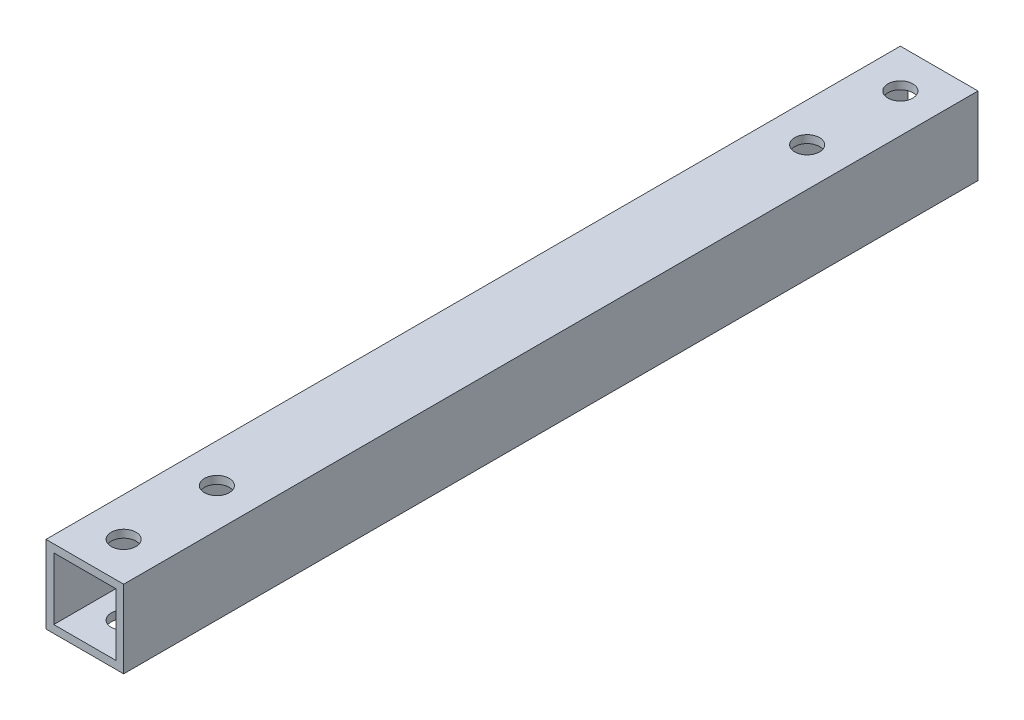
ISO-10303-21;
HEADER;
FILE_DESCRIPTION(('STEP AP214'),'2;1');
FILE_NAME('part.step','',(''),(''),'','','');
FILE_SCHEMA(('AUTOMOTIVE_DESIGN { 1 0 10303 214 1 1 1 1 }'));
ENDSEC;
DATA;
#1=APPLICATION_CONTEXT('core data for automotive mechanical design processes');
#2=APPLICATION_PROTOCOL_DEFINITION('international standard','automotive_design',2000,#1);
#3=PRODUCT_CONTEXT('',#1,'mechanical');
#4=PRODUCT('Part','Part','',(#3));
#5=PRODUCT_RELATED_PRODUCT_CATEGORY('part','',(#4));
#6=PRODUCT_DEFINITION_FORMATION('','',#4);
#7=PRODUCT_DEFINITION_CONTEXT('part definition',#1,'design');
#8=PRODUCT_DEFINITION('design','',#6,#7);
#9=PRODUCT_DEFINITION_SHAPE('','',#8);
#10=(LENGTH_UNIT() NAMED_UNIT(*) SI_UNIT(.MILLI.,.METRE.));
#11=(NAMED_UNIT(*) PLANE_ANGLE_UNIT() SI_UNIT($,.RADIAN.));
#12=(NAMED_UNIT(*) SI_UNIT($,.STERADIAN.) SOLID_ANGLE_UNIT());
#13=UNCERTAINTY_MEASURE_WITH_UNIT(LENGTH_MEASURE(1.E-05),#10,'distance_accuracy_value','');
#14=(GEOMETRIC_REPRESENTATION_CONTEXT(3) GLOBAL_UNCERTAINTY_ASSIGNED_CONTEXT((#13)) GLOBAL_UNIT_ASSIGNED_CONTEXT((#10,
#11,#12)) REPRESENTATION_CONTEXT('',''));
#15=CARTESIAN_POINT('',(0.,0.,0.));
#16=DIRECTION('',(0.,0.,1.));
#17=DIRECTION('',(1.,0.,0.));
#18=AXIS2_PLACEMENT_3D('',#15,#16,#17);
#19=CARTESIAN_POINT('',(0.,0.,110.));
#20=DIRECTION('',(0.,0.,1.));
#21=DIRECTION('',(1.,0.,0.));
#22=AXIS2_PLACEMENT_3D('',#19,#20,#21);
#23=PLANE('',#22);
#24=DIRECTION('',(0.,1.,0.));
#25=VECTOR('',#24,1.);
#26=CARTESIAN_POINT('',(5.,-5.,110.));
#27=LINE('',#26,#25);
#28=CARTESIAN_POINT('',(5.,-5.,110.));
#29=VERTEX_POINT('',#28);
#30=CARTESIAN_POINT('',(5.,5.,110.));
#31=VERTEX_POINT('',#30);
#32=EDGE_CURVE('E162',#29,#31,#27,.T.);
#33=ORIENTED_EDGE('',*,*,#32,.T.);
#34=DIRECTION('',(-1.,0.,0.));
#35=VECTOR('',#34,1.);
#36=CARTESIAN_POINT('',(-5.,5.,110.));
#37=LINE('',#36,#35);
#38=CARTESIAN_POINT('',(-5.,5.,110.));
#39=VERTEX_POINT('',#38);
#40=EDGE_CURVE('E165',#31,#39,#37,.T.);
#41=ORIENTED_EDGE('',*,*,#40,.T.);
#42=DIRECTION('',(0.,-1.,0.));
#43=VECTOR('',#42,1.);
#44=CARTESIAN_POINT('',(-5.,-5.,110.));
#45=LINE('',#44,#43);
#46=CARTESIAN_POINT('',(-5.,-5.,110.));
#47=VERTEX_POINT('',#46);
#48=EDGE_CURVE('E168',#39,#47,#45,.T.);
#49=ORIENTED_EDGE('',*,*,#48,.T.);
#50=DIRECTION('',(1.,0.,0.));
#51=VECTOR('',#50,1.);
#52=CARTESIAN_POINT('',(-5.,-5.,110.));
#53=LINE('',#52,#51);
#54=EDGE_CURVE('E170',#47,#29,#53,.T.);
#55=ORIENTED_EDGE('',*,*,#54,.T.);
#56=EDGE_LOOP('',(#33,#41,#49,#55));
#57=FACE_BOUND('',#56,.T.);
#58=DIRECTION('',(-1.,0.,0.));
#59=VECTOR('',#58,1.);
#60=CARTESIAN_POINT('',(0.,4.,110.));
#61=LINE('',#60,#59);
#62=CARTESIAN_POINT('',(4.,4.,110.));
#63=VERTEX_POINT('',#62);
#64=CARTESIAN_POINT('',(-4.,4.,110.));
#65=VERTEX_POINT('',#64);
#66=EDGE_CURVE('E132',#63,#65,#61,.T.);
#67=ORIENTED_EDGE('',*,*,#66,.F.);
#68=DIRECTION('',(0.,1.,0.));
#69=VECTOR('',#68,1.);
#70=CARTESIAN_POINT('',(4.,0.,110.));
#71=LINE('',#70,#69);
#72=CARTESIAN_POINT('',(4.,-4.,110.));
#73=VERTEX_POINT('',#72);
#74=EDGE_CURVE('E124',#73,#63,#71,.T.);
#75=ORIENTED_EDGE('',*,*,#74,.F.);
#76=DIRECTION('',(1.,0.,0.));
#77=VECTOR('',#76,1.);
#78=CARTESIAN_POINT('',(0.,-4.,110.));
#79=LINE('',#78,#77);
#80=CARTESIAN_POINT('',(-4.,-4.,110.));
#81=VERTEX_POINT('',#80);
#82=EDGE_CURVE('E146',#81,#73,#79,.T.);
#83=ORIENTED_EDGE('',*,*,#82,.F.);
#84=DIRECTION('',(0.,-1.,0.));
#85=VECTOR('',#84,1.);
#86=CARTESIAN_POINT('',(-4.,0.,110.));
#87=LINE('',#86,#85);
#88=EDGE_CURVE('E144',#65,#81,#87,.T.);
#89=ORIENTED_EDGE('',*,*,#88,.F.);
#90=EDGE_LOOP('',(#67,#75,#83,#89));
#91=FACE_BOUND('',#90,.T.);
#92=ADVANCED_FACE('F57',(#57,#91),#23,.T.);
#93=CARTESIAN_POINT('',(0.,0.,0.));
#94=DIRECTION('',(0.,0.,1.));
#95=DIRECTION('',(1.,0.,0.));
#96=AXIS2_PLACEMENT_3D('',#93,#94,#95);
#97=PLANE('',#96);
#98=DIRECTION('',(0.,1.,0.));
#99=VECTOR('',#98,1.);
#100=CARTESIAN_POINT('',(5.,-5.,0.));
#101=LINE('',#100,#99);
#102=CARTESIAN_POINT('',(5.,-5.,0.));
#103=VERTEX_POINT('',#102);
#104=CARTESIAN_POINT('',(5.,5.,0.));
#105=VERTEX_POINT('',#104);
#106=EDGE_CURVE('E140',#103,#105,#101,.T.);
#107=ORIENTED_EDGE('',*,*,#106,.F.);
#108=DIRECTION('',(1.,0.,0.));
#109=VECTOR('',#108,1.);
#110=CARTESIAN_POINT('',(-5.,-5.,0.));
#111=LINE('',#110,#109);
#112=CARTESIAN_POINT('',(-5.,-5.,0.));
#113=VERTEX_POINT('',#112);
#114=EDGE_CURVE('E166',#113,#103,#111,.T.);
#115=ORIENTED_EDGE('',*,*,#114,.F.);
#116=DIRECTION('',(0.,-1.,0.));
#117=VECTOR('',#116,1.);
#118=CARTESIAN_POINT('',(-5.,-5.,0.));
#119=LINE('',#118,#117);
#120=CARTESIAN_POINT('',(-5.,5.,0.));
#121=VERTEX_POINT('',#120);
#122=EDGE_CURVE('E177',#121,#113,#119,.T.);
#123=ORIENTED_EDGE('',*,*,#122,.F.);
#124=DIRECTION('',(-1.,0.,0.));
#125=VECTOR('',#124,1.);
#126=CARTESIAN_POINT('',(-5.,5.,0.));
#127=LINE('',#126,#125);
#128=EDGE_CURVE('E175',#105,#121,#127,.T.);
#129=ORIENTED_EDGE('',*,*,#128,.F.);
#130=EDGE_LOOP('',(#107,#115,#123,#129));
#131=FACE_BOUND('',#130,.T.);
#132=DIRECTION('',(0.,1.,0.));
#133=VECTOR('',#132,1.);
#134=CARTESIAN_POINT('',(4.,0.,0.));
#135=LINE('',#134,#133);
#136=CARTESIAN_POINT('',(4.,-4.,0.));
#137=VERTEX_POINT('',#136);
#138=CARTESIAN_POINT('',(4.,4.,0.));
#139=VERTEX_POINT('',#138);
#140=EDGE_CURVE('E82',#137,#139,#135,.T.);
#141=ORIENTED_EDGE('',*,*,#140,.T.);
#142=DIRECTION('',(-1.,0.,0.));
#143=VECTOR('',#142,1.);
#144=CARTESIAN_POINT('',(0.,4.,0.));
#145=LINE('',#144,#143);
#146=CARTESIAN_POINT('',(-4.,4.,0.));
#147=VERTEX_POINT('',#146);
#148=EDGE_CURVE('E139',#139,#147,#145,.T.);
#149=ORIENTED_EDGE('',*,*,#148,.T.);
#150=DIRECTION('',(0.,-1.,0.));
#151=VECTOR('',#150,1.);
#152=CARTESIAN_POINT('',(-4.,0.,0.));
#153=LINE('',#152,#151);
#154=CARTESIAN_POINT('',(-4.,-4.,0.));
#155=VERTEX_POINT('',#154);
#156=EDGE_CURVE('E154',#147,#155,#153,.T.);
#157=ORIENTED_EDGE('',*,*,#156,.T.);
#158=DIRECTION('',(1.,0.,0.));
#159=VECTOR('',#158,1.);
#160=CARTESIAN_POINT('',(0.,-4.,0.));
#161=LINE('',#160,#159);
#162=EDGE_CURVE('E133',#155,#137,#161,.T.);
#163=ORIENTED_EDGE('',*,*,#162,.T.);
#164=EDGE_LOOP('',(#141,#149,#157,#163));
#165=FACE_BOUND('',#164,.T.);
#166=ADVANCED_FACE('F229',(#131,#165),#97,.F.);
#167=CARTESIAN_POINT('',(5.,-5.,110.));
#168=DIRECTION('',(-1.,0.,0.));
#169=DIRECTION('',(0.,0.,1.));
#170=AXIS2_PLACEMENT_3D('',#167,#168,#169);
#171=PLANE('',#170);
#172=ORIENTED_EDGE('',*,*,#106,.T.);
#173=DIRECTION('',(0.,0.,-1.));
#174=VECTOR('',#173,1.);
#175=CARTESIAN_POINT('',(5.,5.,110.));
#176=LINE('',#175,#174);
#177=EDGE_CURVE('E12',#31,#105,#176,.T.);
#178=ORIENTED_EDGE('',*,*,#177,.F.);
#179=ORIENTED_EDGE('',*,*,#32,.F.);
#180=DIRECTION('',(0.,0.,-1.));
#181=VECTOR('',#180,1.);
#182=CARTESIAN_POINT('',(5.,-5.,110.));
#183=LINE('',#182,#181);
#184=EDGE_CURVE('E172',#29,#103,#183,.T.);
#185=ORIENTED_EDGE('',*,*,#184,.T.);
#186=EDGE_LOOP('',(#172,#178,#179,#185));
#187=FACE_BOUND('',#186,.T.);
#188=ADVANCED_FACE('F59',(#187),#171,.F.);
#189=CARTESIAN_POINT('',(-5.,5.,110.));
#190=DIRECTION('',(0.,-1.,0.));
#191=DIRECTION('',(0.,0.,-1.));
#192=AXIS2_PLACEMENT_3D('',#189,#190,#191);
#193=PLANE('',#192);
#194=CARTESIAN_POINT('',(0.,5.,5.));
#195=DIRECTION('',(0.,1.,0.));
#196=DIRECTION('',(0.,0.,1.));
#197=AXIS2_PLACEMENT_3D('',#194,#195,#196);
#198=CIRCLE('',#197,1.6);
#199=CARTESIAN_POINT('',(0.,5.,6.6));
#200=VERTEX_POINT('',#199);
#201=EDGE_CURVE('E265',#200,#200,#198,.T.);
#202=ORIENTED_EDGE('',*,*,#201,.F.);
#203=EDGE_LOOP('',(#202));
#204=FACE_BOUND('',#203,.T.);
#205=CARTESIAN_POINT('',(0.,5.,17.));
#206=DIRECTION('',(0.,1.,0.));
#207=DIRECTION('',(0.,0.,1.));
#208=AXIS2_PLACEMENT_3D('',#205,#206,#207);
#209=CIRCLE('',#208,1.6);
#210=CARTESIAN_POINT('',(0.,5.,18.6));
#211=VERTEX_POINT('',#210);
#212=EDGE_CURVE('E269',#211,#211,#209,.T.);
#213=ORIENTED_EDGE('',*,*,#212,.F.);
#214=EDGE_LOOP('',(#213));
#215=FACE_BOUND('',#214,.T.);
#216=CARTESIAN_POINT('',(0.,5.,93.));
#217=DIRECTION('',(0.,1.,0.));
#218=DIRECTION('',(0.,0.,-1.));
#219=AXIS2_PLACEMENT_3D('',#216,#217,#218);
#220=CIRCLE('',#219,1.6);
#221=CARTESIAN_POINT('',(0.,5.,91.4));
#222=VERTEX_POINT('',#221);
#223=EDGE_CURVE('E273',#222,#222,#220,.T.);
#224=ORIENTED_EDGE('',*,*,#223,.F.);
#225=EDGE_LOOP('',(#224));
#226=FACE_BOUND('',#225,.T.);
#227=CARTESIAN_POINT('',(0.,5.,105.));
#228=DIRECTION('',(0.,1.,0.));
#229=DIRECTION('',(0.,0.,-1.));
#230=AXIS2_PLACEMENT_3D('',#227,#228,#229);
#231=CIRCLE('',#230,1.6);
#232=CARTESIAN_POINT('',(0.,5.,103.4));
#233=VERTEX_POINT('',#232);
#234=EDGE_CURVE('E277',#233,#233,#231,.T.);
#235=ORIENTED_EDGE('',*,*,#234,.F.);
#236=EDGE_LOOP('',(#235));
#237=FACE_BOUND('',#236,.T.);
#238=ORIENTED_EDGE('',*,*,#128,.T.);
#239=DIRECTION('',(0.,0.,-1.));
#240=VECTOR('',#239,1.);
#241=CARTESIAN_POINT('',(-5.,5.,110.));
#242=LINE('',#241,#240);
#243=EDGE_CURVE('E66',#39,#121,#242,.T.);
#244=ORIENTED_EDGE('',*,*,#243,.F.);
#245=ORIENTED_EDGE('',*,*,#40,.F.);
#246=ORIENTED_EDGE('',*,*,#177,.T.);
#247=EDGE_LOOP('',(#238,#244,#245,#246));
#248=FACE_BOUND('',#247,.T.);
#249=ADVANCED_FACE('F254',(#204,#215,#226,#237,#248),#193,.F.);
#250=CARTESIAN_POINT('',(-5.,-5.,110.));
#251=DIRECTION('',(1.,0.,0.));
#252=DIRECTION('',(0.,0.,-1.));
#253=AXIS2_PLACEMENT_3D('',#250,#251,#252);
#254=PLANE('',#253);
#255=ORIENTED_EDGE('',*,*,#122,.T.);
#256=DIRECTION('',(0.,0.,-1.));
#257=VECTOR('',#256,1.);
#258=CARTESIAN_POINT('',(-5.,-5.,110.));
#259=LINE('',#258,#257);
#260=EDGE_CURVE('E182',#47,#113,#259,.T.);
#261=ORIENTED_EDGE('',*,*,#260,.F.);
#262=ORIENTED_EDGE('',*,*,#48,.F.);
#263=ORIENTED_EDGE('',*,*,#243,.T.);
#264=EDGE_LOOP('',(#255,#261,#262,#263));
#265=FACE_BOUND('',#264,.T.);
#266=ADVANCED_FACE('F251',(#265),#254,.F.);
#267=CARTESIAN_POINT('',(-5.,-5.,110.));
#268=DIRECTION('',(0.,1.,0.));
#269=DIRECTION('',(0.,0.,1.));
#270=AXIS2_PLACEMENT_3D('',#267,#268,#269);
#271=PLANE('',#270);
#272=CARTESIAN_POINT('',(0.,-5.,5.));
#273=DIRECTION('',(0.,1.,0.));
#274=DIRECTION('',(0.,0.,1.));
#275=AXIS2_PLACEMENT_3D('',#272,#273,#274);
#276=CIRCLE('',#275,1.6);
#277=CARTESIAN_POINT('',(0.,-5.,6.6));
#278=VERTEX_POINT('',#277);
#279=EDGE_CURVE('E191',#278,#278,#276,.T.);
#280=ORIENTED_EDGE('',*,*,#279,.T.);
#281=EDGE_LOOP('',(#280));
#282=FACE_BOUND('',#281,.T.);
#283=CARTESIAN_POINT('',(0.,-5.,17.));
#284=DIRECTION('',(0.,1.,0.));
#285=DIRECTION('',(0.,0.,1.));
#286=AXIS2_PLACEMENT_3D('',#283,#284,#285);
#287=CIRCLE('',#286,1.6);
#288=CARTESIAN_POINT('',(0.,-5.,18.6));
#289=VERTEX_POINT('',#288);
#290=EDGE_CURVE('E299',#289,#289,#287,.T.);
#291=ORIENTED_EDGE('',*,*,#290,.T.);
#292=EDGE_LOOP('',(#291));
#293=FACE_BOUND('',#292,.T.);
#294=CARTESIAN_POINT('',(0.,-5.,93.));
#295=DIRECTION('',(0.,1.,0.));
#296=DIRECTION('',(0.,0.,-1.));
#297=AXIS2_PLACEMENT_3D('',#294,#295,#296);
#298=CIRCLE('',#297,1.6);
#299=CARTESIAN_POINT('',(0.,-5.,91.4));
#300=VERTEX_POINT('',#299);
#301=EDGE_CURVE('E295',#300,#300,#298,.T.);
#302=ORIENTED_EDGE('',*,*,#301,.T.);
#303=EDGE_LOOP('',(#302));
#304=FACE_BOUND('',#303,.T.);
#305=CARTESIAN_POINT('',(0.,-5.,105.));
#306=DIRECTION('',(0.,1.,0.));
#307=DIRECTION('',(0.,0.,-1.));
#308=AXIS2_PLACEMENT_3D('',#305,#306,#307);
#309=CIRCLE('',#308,1.6);
#310=CARTESIAN_POINT('',(0.,-5.,103.4));
#311=VERTEX_POINT('',#310);
#312=EDGE_CURVE('E290',#311,#311,#309,.T.);
#313=ORIENTED_EDGE('',*,*,#312,.T.);
#314=EDGE_LOOP('',(#313));
#315=FACE_BOUND('',#314,.T.);
#316=ORIENTED_EDGE('',*,*,#114,.T.);
#317=ORIENTED_EDGE('',*,*,#184,.F.);
#318=ORIENTED_EDGE('',*,*,#54,.F.);
#319=ORIENTED_EDGE('',*,*,#260,.T.);
#320=EDGE_LOOP('',(#316,#317,#318,#319));
#321=FACE_BOUND('',#320,.T.);
#322=ADVANCED_FACE('F248',(#282,#293,#304,#315,#321),#271,.F.);
#323=CARTESIAN_POINT('',(4.,0.,110.));
#324=DIRECTION('',(-1.,0.,0.));
#325=DIRECTION('',(0.,0.,1.));
#326=AXIS2_PLACEMENT_3D('',#323,#324,#325);
#327=PLANE('',#326);
#328=ORIENTED_EDGE('',*,*,#140,.F.);
#329=DIRECTION('',(0.,0.,-1.));
#330=VECTOR('',#329,1.);
#331=CARTESIAN_POINT('',(4.,-4.,110.));
#332=LINE('',#331,#330);
#333=EDGE_CURVE('E128',#73,#137,#332,.T.);
#334=ORIENTED_EDGE('',*,*,#333,.F.);
#335=ORIENTED_EDGE('',*,*,#74,.T.);
#336=DIRECTION('',(0.,0.,-1.));
#337=VECTOR('',#336,1.);
#338=CARTESIAN_POINT('',(4.,4.,110.));
#339=LINE('',#338,#337);
#340=EDGE_CURVE('E127',#63,#139,#339,.T.);
#341=ORIENTED_EDGE('',*,*,#340,.T.);
#342=EDGE_LOOP('',(#328,#334,#335,#341));
#343=FACE_BOUND('',#342,.T.);
#344=ADVANCED_FACE('F126',(#343),#327,.T.);
#345=CARTESIAN_POINT('',(0.,4.,110.));
#346=DIRECTION('',(0.,-1.,0.));
#347=DIRECTION('',(0.,0.,-1.));
#348=AXIS2_PLACEMENT_3D('',#345,#346,#347);
#349=PLANE('',#348);
#350=CARTESIAN_POINT('',(0.,4.,5.));
#351=DIRECTION('',(0.,-1.,0.));
#352=DIRECTION('',(0.,0.,-1.));
#353=AXIS2_PLACEMENT_3D('',#350,#351,#352);
#354=CIRCLE('',#353,1.6);
#355=CARTESIAN_POINT('',(0.,4.,3.4));
#356=VERTEX_POINT('',#355);
#357=EDGE_CURVE('E152',#356,#356,#354,.T.);
#358=ORIENTED_EDGE('',*,*,#357,.F.);
#359=EDGE_LOOP('',(#358));
#360=FACE_BOUND('',#359,.T.);
#361=CARTESIAN_POINT('',(0.,4.,17.));
#362=DIRECTION('',(0.,-1.,0.));
#363=DIRECTION('',(0.,0.,-1.));
#364=AXIS2_PLACEMENT_3D('',#361,#362,#363);
#365=CIRCLE('',#364,1.6);
#366=CARTESIAN_POINT('',(0.,4.,15.4));
#367=VERTEX_POINT('',#366);
#368=EDGE_CURVE('E197',#367,#367,#365,.T.);
#369=ORIENTED_EDGE('',*,*,#368,.F.);
#370=EDGE_LOOP('',(#369));
#371=FACE_BOUND('',#370,.T.);
#372=CARTESIAN_POINT('',(0.,4.,93.));
#373=DIRECTION('',(0.,-1.,0.));
#374=DIRECTION('',(0.,0.,-1.));
#375=AXIS2_PLACEMENT_3D('',#372,#373,#374);
#376=CIRCLE('',#375,1.6);
#377=CARTESIAN_POINT('',(0.,4.,91.4));
#378=VERTEX_POINT('',#377);
#379=EDGE_CURVE('E194',#378,#378,#376,.T.);
#380=ORIENTED_EDGE('',*,*,#379,.F.);
#381=EDGE_LOOP('',(#380));
#382=FACE_BOUND('',#381,.T.);
#383=CARTESIAN_POINT('',(0.,4.,105.));
#384=DIRECTION('',(0.,-1.,0.));
#385=DIRECTION('',(0.,0.,-1.));
#386=AXIS2_PLACEMENT_3D('',#383,#384,#385);
#387=CIRCLE('',#386,1.6);
#388=CARTESIAN_POINT('',(0.,4.,103.4));
#389=VERTEX_POINT('',#388);
#390=EDGE_CURVE('E190',#389,#389,#387,.T.);
#391=ORIENTED_EDGE('',*,*,#390,.F.);
#392=EDGE_LOOP('',(#391));
#393=FACE_BOUND('',#392,.T.);
#394=ORIENTED_EDGE('',*,*,#148,.F.);
#395=ORIENTED_EDGE('',*,*,#340,.F.);
#396=ORIENTED_EDGE('',*,*,#66,.T.);
#397=DIRECTION('',(0.,0.,-1.));
#398=VECTOR('',#397,1.);
#399=CARTESIAN_POINT('',(-4.,4.,110.));
#400=LINE('',#399,#398);
#401=EDGE_CURVE('E141',#65,#147,#400,.T.);
#402=ORIENTED_EDGE('',*,*,#401,.T.);
#403=EDGE_LOOP('',(#394,#395,#396,#402));
#404=FACE_BOUND('',#403,.T.);
#405=ADVANCED_FACE('F136',(#360,#371,#382,#393,#404),#349,.T.);
#406=CARTESIAN_POINT('',(-4.,0.,110.));
#407=DIRECTION('',(1.,0.,0.));
#408=DIRECTION('',(0.,0.,-1.));
#409=AXIS2_PLACEMENT_3D('',#406,#407,#408);
#410=PLANE('',#409);
#411=ORIENTED_EDGE('',*,*,#156,.F.);
#412=ORIENTED_EDGE('',*,*,#401,.F.);
#413=ORIENTED_EDGE('',*,*,#88,.T.);
#414=DIRECTION('',(0.,0.,-1.));
#415=VECTOR('',#414,1.);
#416=CARTESIAN_POINT('',(-4.,-4.,110.));
#417=LINE('',#416,#415);
#418=EDGE_CURVE('E74',#81,#155,#417,.T.);
#419=ORIENTED_EDGE('',*,*,#418,.T.);
#420=EDGE_LOOP('',(#411,#412,#413,#419));
#421=FACE_BOUND('',#420,.T.);
#422=ADVANCED_FACE('F221',(#421),#410,.T.);
#423=CARTESIAN_POINT('',(0.,-4.,110.));
#424=DIRECTION('',(0.,1.,0.));
#425=DIRECTION('',(0.,0.,1.));
#426=AXIS2_PLACEMENT_3D('',#423,#424,#425);
#427=PLANE('',#426);
#428=CARTESIAN_POINT('',(0.,-4.,5.));
#429=DIRECTION('',(0.,1.,0.));
#430=DIRECTION('',(0.,0.,1.));
#431=AXIS2_PLACEMENT_3D('',#428,#429,#430);
#432=CIRCLE('',#431,1.6);
#433=CARTESIAN_POINT('',(0.,-4.,6.6));
#434=VERTEX_POINT('',#433);
#435=EDGE_CURVE('E61',#434,#434,#432,.T.);
#436=ORIENTED_EDGE('',*,*,#435,.F.);
#437=EDGE_LOOP('',(#436));
#438=FACE_BOUND('',#437,.T.);
#439=CARTESIAN_POINT('',(0.,-4.,17.));
#440=DIRECTION('',(0.,1.,0.));
#441=DIRECTION('',(0.,0.,1.));
#442=AXIS2_PLACEMENT_3D('',#439,#440,#441);
#443=CIRCLE('',#442,1.6);
#444=CARTESIAN_POINT('',(0.,-4.,18.6));
#445=VERTEX_POINT('',#444);
#446=EDGE_CURVE('E195',#445,#445,#443,.T.);
#447=ORIENTED_EDGE('',*,*,#446,.F.);
#448=EDGE_LOOP('',(#447));
#449=FACE_BOUND('',#448,.T.);
#450=CARTESIAN_POINT('',(0.,-4.,93.));
#451=DIRECTION('',(0.,1.,0.));
#452=DIRECTION('',(0.,0.,1.));
#453=AXIS2_PLACEMENT_3D('',#450,#451,#452);
#454=CIRCLE('',#453,1.6);
#455=CARTESIAN_POINT('',(0.,-4.,94.6));
#456=VERTEX_POINT('',#455);
#457=EDGE_CURVE('E192',#456,#456,#454,.T.);
#458=ORIENTED_EDGE('',*,*,#457,.F.);
#459=EDGE_LOOP('',(#458));
#460=FACE_BOUND('',#459,.T.);
#461=CARTESIAN_POINT('',(0.,-4.,105.));
#462=DIRECTION('',(0.,1.,0.));
#463=DIRECTION('',(0.,0.,1.));
#464=AXIS2_PLACEMENT_3D('',#461,#462,#463);
#465=CIRCLE('',#464,1.6);
#466=CARTESIAN_POINT('',(0.,-4.,106.6));
#467=VERTEX_POINT('',#466);
#468=EDGE_CURVE('E187',#467,#467,#465,.T.);
#469=ORIENTED_EDGE('',*,*,#468,.F.);
#470=EDGE_LOOP('',(#469));
#471=FACE_BOUND('',#470,.T.);
#472=ORIENTED_EDGE('',*,*,#162,.F.);
#473=ORIENTED_EDGE('',*,*,#418,.F.);
#474=ORIENTED_EDGE('',*,*,#82,.T.);
#475=ORIENTED_EDGE('',*,*,#333,.T.);
#476=EDGE_LOOP('',(#472,#473,#474,#475));
#477=FACE_BOUND('',#476,.T.);
#478=ADVANCED_FACE('F217',(#438,#449,#460,#471,#477),#427,.T.);
#479=CARTESIAN_POINT('',(0.,-5.,105.));
#480=DIRECTION('',(0.,1.,0.));
#481=DIRECTION('',(0.,0.,1.));
#482=AXIS2_PLACEMENT_3D('',#479,#480,#481);
#483=CYLINDRICAL_SURFACE('',#482,1.6);
#484=ORIENTED_EDGE('',*,*,#468,.T.);
#485=EDGE_LOOP('',(#484));
#486=FACE_BOUND('',#485,.T.);
#487=ORIENTED_EDGE('',*,*,#312,.F.);
#488=EDGE_LOOP('',(#487));
#489=FACE_BOUND('',#488,.T.);
#490=ADVANCED_FACE('F220',(#486,#489),#483,.F.);
#491=CARTESIAN_POINT('',(0.,-5.,93.));
#492=DIRECTION('',(0.,1.,0.));
#493=DIRECTION('',(0.,0.,1.));
#494=AXIS2_PLACEMENT_3D('',#491,#492,#493);
#495=CYLINDRICAL_SURFACE('',#494,1.6);
#496=ORIENTED_EDGE('',*,*,#457,.T.);
#497=EDGE_LOOP('',(#496));
#498=FACE_BOUND('',#497,.T.);
#499=ORIENTED_EDGE('',*,*,#301,.F.);
#500=EDGE_LOOP('',(#499));
#501=FACE_BOUND('',#500,.T.);
#502=ADVANCED_FACE('F318',(#498,#501),#495,.F.);
#503=CARTESIAN_POINT('',(0.,-5.,17.));
#504=DIRECTION('',(0.,1.,0.));
#505=DIRECTION('',(0.,0.,1.));
#506=AXIS2_PLACEMENT_3D('',#503,#504,#505);
#507=CYLINDRICAL_SURFACE('',#506,1.6);
#508=ORIENTED_EDGE('',*,*,#446,.T.);
#509=EDGE_LOOP('',(#508));
#510=FACE_BOUND('',#509,.T.);
#511=ORIENTED_EDGE('',*,*,#290,.F.);
#512=EDGE_LOOP('',(#511));
#513=FACE_BOUND('',#512,.T.);
#514=ADVANCED_FACE('F308',(#510,#513),#507,.F.);
#515=CARTESIAN_POINT('',(0.,-5.,5.));
#516=DIRECTION('',(0.,1.,0.));
#517=DIRECTION('',(0.,0.,1.));
#518=AXIS2_PLACEMENT_3D('',#515,#516,#517);
#519=CYLINDRICAL_SURFACE('',#518,1.6);
#520=ORIENTED_EDGE('',*,*,#435,.T.);
#521=EDGE_LOOP('',(#520));
#522=FACE_BOUND('',#521,.T.);
#523=ORIENTED_EDGE('',*,*,#279,.F.);
#524=EDGE_LOOP('',(#523));
#525=FACE_BOUND('',#524,.T.);
#526=ADVANCED_FACE('F214',(#522,#525),#519,.F.);
#527=ORIENTED_EDGE('',*,*,#390,.T.);
#528=EDGE_LOOP('',(#527));
#529=FACE_BOUND('',#528,.T.);
#530=ORIENTED_EDGE('',*,*,#234,.T.);
#531=EDGE_LOOP('',(#530));
#532=FACE_BOUND('',#531,.T.);
#533=ADVANCED_FACE('F307',(#529,#532),#483,.F.);
#534=ORIENTED_EDGE('',*,*,#379,.T.);
#535=EDGE_LOOP('',(#534));
#536=FACE_BOUND('',#535,.T.);
#537=ORIENTED_EDGE('',*,*,#223,.T.);
#538=EDGE_LOOP('',(#537));
#539=FACE_BOUND('',#538,.T.);
#540=ADVANCED_FACE('F315',(#536,#539),#495,.F.);
#541=ORIENTED_EDGE('',*,*,#368,.T.);
#542=EDGE_LOOP('',(#541));
#543=FACE_BOUND('',#542,.T.);
#544=ORIENTED_EDGE('',*,*,#212,.T.);
#545=EDGE_LOOP('',(#544));
#546=FACE_BOUND('',#545,.T.);
#547=ADVANCED_FACE('F320',(#543,#546),#507,.F.);
#548=ORIENTED_EDGE('',*,*,#357,.T.);
#549=EDGE_LOOP('',(#548));
#550=FACE_BOUND('',#549,.T.);
#551=ORIENTED_EDGE('',*,*,#201,.T.);
#552=EDGE_LOOP('',(#551));
#553=FACE_BOUND('',#552,.T.);
#554=ADVANCED_FACE('F310',(#550,#553),#519,.F.);
#555=CLOSED_SHELL('',(#92,#166,#188,#249,#266,#322,#344,#405,#422,#478,#490,#502,#514,#526,#533,
#540,#547,#554));
#556=MANIFOLD_SOLID_BREP('B2',#555);
#557=ADVANCED_BREP_SHAPE_REPRESENTATION('',(#18,#556),#14);
#558=SHAPE_DEFINITION_REPRESENTATION(#9,#557);
ENDSEC;
END-ISO-10303-21;
